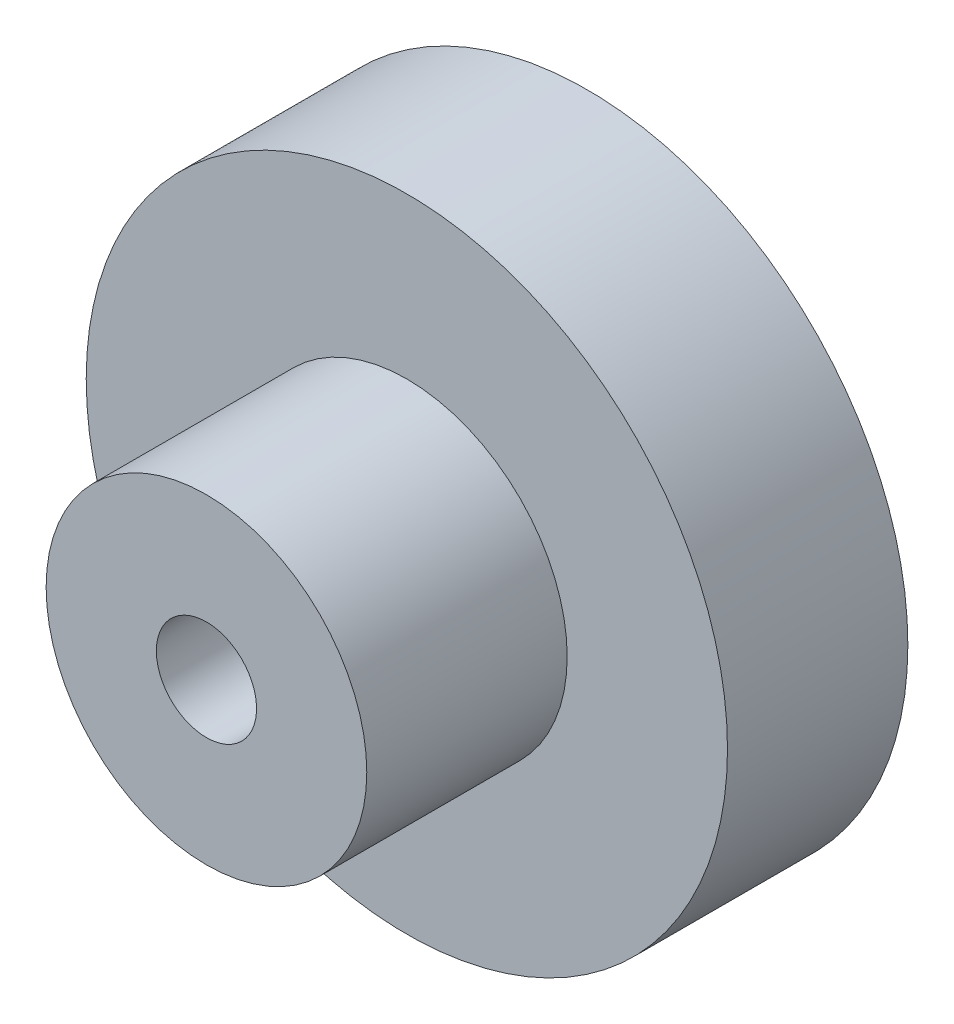
ISO-10303-21;
HEADER;
FILE_DESCRIPTION(('STEP AP214'),'2;1');
FILE_NAME('part.step','',(''),(''),'','','');
FILE_SCHEMA(('AUTOMOTIVE_DESIGN { 1 0 10303 214 1 1 1 1 }'));
ENDSEC;
DATA;
#1=APPLICATION_CONTEXT('core data for automotive mechanical design processes');
#2=APPLICATION_PROTOCOL_DEFINITION('international standard','automotive_design',2000,#1);
#3=PRODUCT_CONTEXT('',#1,'mechanical');
#4=PRODUCT('Part','Part','',(#3));
#5=PRODUCT_RELATED_PRODUCT_CATEGORY('part','',(#4));
#6=PRODUCT_DEFINITION_FORMATION('','',#4);
#7=PRODUCT_DEFINITION_CONTEXT('part definition',#1,'design');
#8=PRODUCT_DEFINITION('design','',#6,#7);
#9=PRODUCT_DEFINITION_SHAPE('','',#8);
#10=(LENGTH_UNIT() NAMED_UNIT(*) SI_UNIT(.MILLI.,.METRE.));
#11=(NAMED_UNIT(*) PLANE_ANGLE_UNIT() SI_UNIT($,.RADIAN.));
#12=(NAMED_UNIT(*) SI_UNIT($,.STERADIAN.) SOLID_ANGLE_UNIT());
#13=UNCERTAINTY_MEASURE_WITH_UNIT(LENGTH_MEASURE(1.E-05),#10,'distance_accuracy_value','');
#14=(GEOMETRIC_REPRESENTATION_CONTEXT(3) GLOBAL_UNCERTAINTY_ASSIGNED_CONTEXT((#13)) GLOBAL_UNIT_ASSIGNED_CONTEXT((#10,
#11,#12)) REPRESENTATION_CONTEXT('',''));
#15=CARTESIAN_POINT('',(0.,0.,0.));
#16=DIRECTION('',(0.,0.,1.));
#17=DIRECTION('',(1.,0.,0.));
#18=AXIS2_PLACEMENT_3D('',#15,#16,#17);
#19=CARTESIAN_POINT('',(0.,1.25,7.52054794520548));
#20=DIRECTION('',(0.,0.,1.));
#21=DIRECTION('',(1.,0.,0.));
#22=AXIS2_PLACEMENT_3D('',#19,#20,#21);
#23=PLANE('',#22);
#24=CARTESIAN_POINT('',(0.,0.,7.52054794520548));
#25=DIRECTION('',(0.,0.,-1.));
#26=DIRECTION('',(-1.,0.,0.));
#27=AXIS2_PLACEMENT_3D('',#24,#25,#26);
#28=CIRCLE('',#27,1.25);
#29=CARTESIAN_POINT('',(-1.25,0.,7.52054794520548));
#30=VERTEX_POINT('',#29);
#31=EDGE_CURVE('E64',#30,#30,#28,.T.);
#32=ORIENTED_EDGE('',*,*,#31,.T.);
#33=EDGE_LOOP('',(#32));
#34=FACE_BOUND('',#33,.T.);
#35=CARTESIAN_POINT('',(0.,0.,7.52054794520548));
#36=DIRECTION('',(0.,0.,-1.));
#37=DIRECTION('',(-1.,0.,0.));
#38=AXIS2_PLACEMENT_3D('',#35,#36,#37);
#39=CIRCLE('',#38,4.);
#40=CARTESIAN_POINT('',(-4.,0.,7.52054794520548));
#41=VERTEX_POINT('',#40);
#42=EDGE_CURVE('E10',#41,#41,#39,.T.);
#43=ORIENTED_EDGE('',*,*,#42,.F.);
#44=EDGE_LOOP('',(#43));
#45=FACE_BOUND('',#44,.T.);
#46=ADVANCED_FACE('F37',(#34,#45),#23,.T.);
#47=CARTESIAN_POINT('',(0.,0.,0.));
#48=DIRECTION('',(0.,0.,-1.));
#49=DIRECTION('',(-1.,0.,0.));
#50=AXIS2_PLACEMENT_3D('',#47,#48,#49);
#51=CYLINDRICAL_SURFACE('',#50,4.);
#52=ORIENTED_EDGE('',*,*,#42,.T.);
#53=EDGE_LOOP('',(#52));
#54=FACE_BOUND('',#53,.T.);
#55=CARTESIAN_POINT('',(0.,0.,2.52054794520548));
#56=DIRECTION('',(0.,0.,-1.));
#57=DIRECTION('',(-1.,0.,0.));
#58=AXIS2_PLACEMENT_3D('',#55,#56,#57);
#59=CIRCLE('',#58,4.);
#60=CARTESIAN_POINT('',(-4.,0.,2.52054794520548));
#61=VERTEX_POINT('',#60);
#62=EDGE_CURVE('E44',#61,#61,#59,.T.);
#63=ORIENTED_EDGE('',*,*,#62,.F.);
#64=EDGE_LOOP('',(#63));
#65=FACE_BOUND('',#64,.T.);
#66=ADVANCED_FACE('F83',(#54,#65),#51,.T.);
#67=CARTESIAN_POINT('',(0.,4.,2.52054794520548));
#68=DIRECTION('',(0.,0.,1.));
#69=DIRECTION('',(1.,0.,0.));
#70=AXIS2_PLACEMENT_3D('',#67,#68,#69);
#71=PLANE('',#70);
#72=ORIENTED_EDGE('',*,*,#62,.T.);
#73=EDGE_LOOP('',(#72));
#74=FACE_BOUND('',#73,.T.);
#75=CARTESIAN_POINT('',(0.,0.,2.52054794520548));
#76=DIRECTION('',(0.,0.,-1.));
#77=DIRECTION('',(-1.,0.,0.));
#78=AXIS2_PLACEMENT_3D('',#75,#76,#77);
#79=CIRCLE('',#78,8.);
#80=CARTESIAN_POINT('',(-8.,0.,2.52054794520548));
#81=VERTEX_POINT('',#80);
#82=EDGE_CURVE('E49',#81,#81,#79,.T.);
#83=ORIENTED_EDGE('',*,*,#82,.F.);
#84=EDGE_LOOP('',(#83));
#85=FACE_BOUND('',#84,.T.);
#86=ADVANCED_FACE('F87',(#74,#85),#71,.T.);
#87=CARTESIAN_POINT('',(0.,0.,0.));
#88=DIRECTION('',(0.,0.,-1.));
#89=DIRECTION('',(-1.,0.,0.));
#90=AXIS2_PLACEMENT_3D('',#87,#88,#89);
#91=CYLINDRICAL_SURFACE('',#90,8.);
#92=ORIENTED_EDGE('',*,*,#82,.T.);
#93=EDGE_LOOP('',(#92));
#94=FACE_BOUND('',#93,.T.);
#95=CARTESIAN_POINT('',(0.,0.,-1.97945205479452));
#96=DIRECTION('',(0.,0.,-1.));
#97=DIRECTION('',(-1.,0.,0.));
#98=AXIS2_PLACEMENT_3D('',#95,#96,#97);
#99=CIRCLE('',#98,8.);
#100=CARTESIAN_POINT('',(-8.,0.,-1.97945205479452));
#101=VERTEX_POINT('',#100);
#102=EDGE_CURVE('E54',#101,#101,#99,.T.);
#103=ORIENTED_EDGE('',*,*,#102,.F.);
#104=EDGE_LOOP('',(#103));
#105=FACE_BOUND('',#104,.T.);
#106=ADVANCED_FACE('F79',(#94,#105),#91,.T.);
#107=CARTESIAN_POINT('',(0.,8.,-1.97945205479452));
#108=DIRECTION('',(0.,0.,-1.));
#109=DIRECTION('',(-1.,0.,0.));
#110=AXIS2_PLACEMENT_3D('',#107,#108,#109);
#111=PLANE('',#110);
#112=ORIENTED_EDGE('',*,*,#102,.T.);
#113=EDGE_LOOP('',(#112));
#114=FACE_BOUND('',#113,.T.);
#115=CARTESIAN_POINT('',(0.,0.,-1.97945205479452));
#116=DIRECTION('',(0.,0.,-1.));
#117=DIRECTION('',(-1.,0.,0.));
#118=AXIS2_PLACEMENT_3D('',#115,#116,#117);
#119=CIRCLE('',#118,1.25);
#120=CARTESIAN_POINT('',(-1.25,0.,-1.97945205479452));
#121=VERTEX_POINT('',#120);
#122=EDGE_CURVE('E60',#121,#121,#119,.T.);
#123=ORIENTED_EDGE('',*,*,#122,.F.);
#124=EDGE_LOOP('',(#123));
#125=FACE_BOUND('',#124,.T.);
#126=ADVANCED_FACE('F73',(#114,#125),#111,.T.);
#127=CARTESIAN_POINT('',(0.,0.,0.));
#128=DIRECTION('',(0.,0.,-1.));
#129=DIRECTION('',(-1.,0.,0.));
#130=AXIS2_PLACEMENT_3D('',#127,#128,#129);
#131=CYLINDRICAL_SURFACE('',#130,1.25);
#132=ORIENTED_EDGE('',*,*,#122,.T.);
#133=EDGE_LOOP('',(#132));
#134=FACE_BOUND('',#133,.T.);
#135=ORIENTED_EDGE('',*,*,#31,.F.);
#136=EDGE_LOOP('',(#135));
#137=FACE_BOUND('',#136,.T.);
#138=ADVANCED_FACE('F71',(#134,#137),#131,.F.);
#139=CLOSED_SHELL('',(#46,#66,#86,#106,#126,#138));
#140=MANIFOLD_SOLID_BREP('B2',#139);
#141=ADVANCED_BREP_SHAPE_REPRESENTATION('',(#18,#140),#14);
#142=SHAPE_DEFINITION_REPRESENTATION(#9,#141);
ENDSEC;
END-ISO-10303-21;
